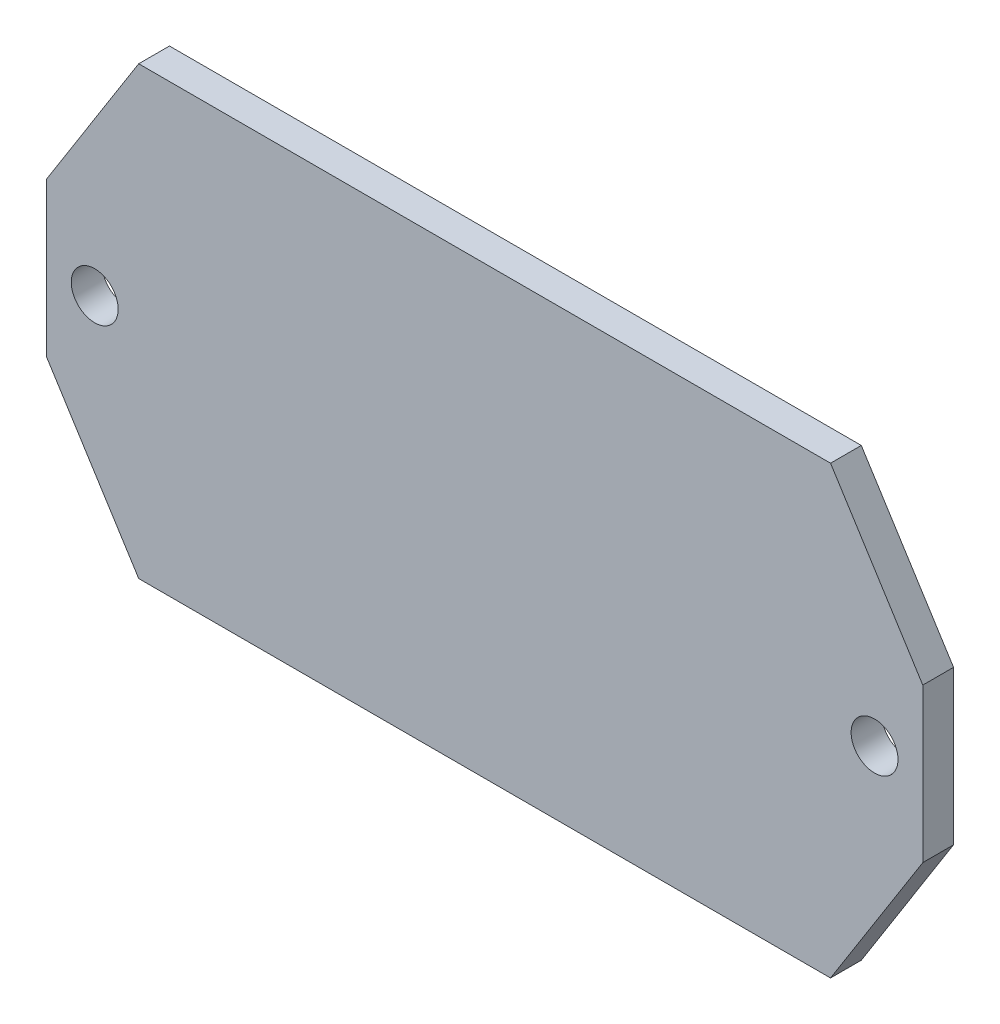
ISO-10303-21;
HEADER;
FILE_DESCRIPTION(('STEP AP214'),'2;1');
FILE_NAME('part.step','',(''),(''),'','','');
FILE_SCHEMA(('AUTOMOTIVE_DESIGN { 1 0 10303 214 1 1 1 1 }'));
ENDSEC;
DATA;
#1=APPLICATION_CONTEXT('core data for automotive mechanical design processes');
#2=APPLICATION_PROTOCOL_DEFINITION('international standard','automotive_design',2000,#1);
#3=PRODUCT_CONTEXT('',#1,'mechanical');
#4=PRODUCT('Part','Part','',(#3));
#5=PRODUCT_RELATED_PRODUCT_CATEGORY('part','',(#4));
#6=PRODUCT_DEFINITION_FORMATION('','',#4);
#7=PRODUCT_DEFINITION_CONTEXT('part definition',#1,'design');
#8=PRODUCT_DEFINITION('design','',#6,#7);
#9=PRODUCT_DEFINITION_SHAPE('','',#8);
#10=(LENGTH_UNIT() NAMED_UNIT(*) SI_UNIT(.MILLI.,.METRE.));
#11=(NAMED_UNIT(*) PLANE_ANGLE_UNIT() SI_UNIT($,.RADIAN.));
#12=(NAMED_UNIT(*) SI_UNIT($,.STERADIAN.) SOLID_ANGLE_UNIT());
#13=UNCERTAINTY_MEASURE_WITH_UNIT(LENGTH_MEASURE(1.E-05),#10,'distance_accuracy_value','');
#14=(GEOMETRIC_REPRESENTATION_CONTEXT(3) GLOBAL_UNCERTAINTY_ASSIGNED_CONTEXT((#13)) GLOBAL_UNIT_ASSIGNED_CONTEXT((#10,
#11,#12)) REPRESENTATION_CONTEXT('',''));
#15=CARTESIAN_POINT('',(0.,0.,0.));
#16=DIRECTION('',(0.,0.,1.));
#17=DIRECTION('',(1.,0.,0.));
#18=AXIS2_PLACEMENT_3D('',#15,#16,#17);
#19=CARTESIAN_POINT('',(-28.5,14.5,2.));
#20=DIRECTION('',(0.,-1.,0.));
#21=DIRECTION('',(0.,0.,-1.));
#22=AXIS2_PLACEMENT_3D('',#19,#20,#21);
#23=PLANE('',#22);
#24=DIRECTION('',(0.,0.,1.));
#25=VECTOR('',#24,1.);
#26=CARTESIAN_POINT('',(-22.5,14.5,0.));
#27=LINE('',#26,#25);
#28=CARTESIAN_POINT('',(-22.5,14.5,0.));
#29=VERTEX_POINT('',#28);
#30=CARTESIAN_POINT('',(-22.5,14.5,2.));
#31=VERTEX_POINT('',#30);
#32=EDGE_CURVE('E52',#29,#31,#27,.T.);
#33=ORIENTED_EDGE('',*,*,#32,.T.);
#34=DIRECTION('',(-1.,0.,0.));
#35=VECTOR('',#34,1.);
#36=CARTESIAN_POINT('',(-28.5,14.5,2.));
#37=LINE('',#36,#35);
#38=CARTESIAN_POINT('',(22.5,14.5,2.));
#39=VERTEX_POINT('',#38);
#40=EDGE_CURVE('E128',#39,#31,#37,.T.);
#41=ORIENTED_EDGE('',*,*,#40,.F.);
#42=DIRECTION('',(0.,0.,1.));
#43=VECTOR('',#42,1.);
#44=CARTESIAN_POINT('',(22.5,14.5,0.));
#45=LINE('',#44,#43);
#46=CARTESIAN_POINT('',(22.5,14.5,0.));
#47=VERTEX_POINT('',#46);
#48=EDGE_CURVE('E145',#47,#39,#45,.T.);
#49=ORIENTED_EDGE('',*,*,#48,.F.);
#50=DIRECTION('',(-1.,0.,0.));
#51=VECTOR('',#50,1.);
#52=CARTESIAN_POINT('',(-28.5,14.5,0.));
#53=LINE('',#52,#51);
#54=EDGE_CURVE('E119',#47,#29,#53,.T.);
#55=ORIENTED_EDGE('',*,*,#54,.T.);
#56=EDGE_LOOP('',(#33,#41,#49,#55));
#57=FACE_BOUND('',#56,.T.);
#58=ADVANCED_FACE('F35',(#57),#23,.F.);
#59=CARTESIAN_POINT('',(-28.5,-14.5,2.));
#60=DIRECTION('',(1.,0.,0.));
#61=DIRECTION('',(0.,0.,-1.));
#62=AXIS2_PLACEMENT_3D('',#59,#60,#61);
#63=PLANE('',#62);
#64=DIRECTION('',(0.,0.,1.));
#65=VECTOR('',#64,1.);
#66=CARTESIAN_POINT('',(-28.5,5.,0.));
#67=LINE('',#66,#65);
#68=CARTESIAN_POINT('',(-28.5,5.,0.));
#69=VERTEX_POINT('',#68);
#70=CARTESIAN_POINT('',(-28.5,5.,2.));
#71=VERTEX_POINT('',#70);
#72=EDGE_CURVE('E101',#69,#71,#67,.T.);
#73=ORIENTED_EDGE('',*,*,#72,.F.);
#74=DIRECTION('',(0.,-1.,0.));
#75=VECTOR('',#74,1.);
#76=CARTESIAN_POINT('',(-28.5,-14.5,0.));
#77=LINE('',#76,#75);
#78=CARTESIAN_POINT('',(-28.5,-4.99999999999999,0.));
#79=VERTEX_POINT('',#78);
#80=EDGE_CURVE('E113',#69,#79,#77,.T.);
#81=ORIENTED_EDGE('',*,*,#80,.T.);
#82=DIRECTION('',(0.,0.,1.));
#83=VECTOR('',#82,1.);
#84=CARTESIAN_POINT('',(-28.5,-5.,0.));
#85=LINE('',#84,#83);
#86=CARTESIAN_POINT('',(-28.5,-5.,2.));
#87=VERTEX_POINT('',#86);
#88=EDGE_CURVE('E60',#79,#87,#85,.T.);
#89=ORIENTED_EDGE('',*,*,#88,.T.);
#90=DIRECTION('',(0.,-1.,0.));
#91=VECTOR('',#90,1.);
#92=CARTESIAN_POINT('',(-28.5,-14.5,2.));
#93=LINE('',#92,#91);
#94=EDGE_CURVE('E44',#71,#87,#93,.T.);
#95=ORIENTED_EDGE('',*,*,#94,.F.);
#96=EDGE_LOOP('',(#73,#81,#89,#95));
#97=FACE_BOUND('',#96,.T.);
#98=ADVANCED_FACE('F112',(#97),#63,.F.);
#99=CARTESIAN_POINT('',(-28.5,-14.5,2.));
#100=DIRECTION('',(0.,1.,0.));
#101=DIRECTION('',(0.,0.,1.));
#102=AXIS2_PLACEMENT_3D('',#99,#100,#101);
#103=PLANE('',#102);
#104=DIRECTION('',(0.,0.,1.));
#105=VECTOR('',#104,1.);
#106=CARTESIAN_POINT('',(-22.5,-14.5,0.));
#107=LINE('',#106,#105);
#108=CARTESIAN_POINT('',(-22.5,-14.5,0.));
#109=VERTEX_POINT('',#108);
#110=CARTESIAN_POINT('',(-22.5,-14.5,2.));
#111=VERTEX_POINT('',#110);
#112=EDGE_CURVE('E153',#109,#111,#107,.T.);
#113=ORIENTED_EDGE('',*,*,#112,.F.);
#114=DIRECTION('',(1.,0.,0.));
#115=VECTOR('',#114,1.);
#116=CARTESIAN_POINT('',(-28.5,-14.5,0.));
#117=LINE('',#116,#115);
#118=CARTESIAN_POINT('',(22.5,-14.5,0.));
#119=VERTEX_POINT('',#118);
#120=EDGE_CURVE('E39',#109,#119,#117,.T.);
#121=ORIENTED_EDGE('',*,*,#120,.T.);
#122=DIRECTION('',(0.,0.,1.));
#123=VECTOR('',#122,1.);
#124=CARTESIAN_POINT('',(22.5,-14.5,0.));
#125=LINE('',#124,#123);
#126=CARTESIAN_POINT('',(22.5,-14.5,2.));
#127=VERTEX_POINT('',#126);
#128=EDGE_CURVE('E135',#119,#127,#125,.T.);
#129=ORIENTED_EDGE('',*,*,#128,.T.);
#130=DIRECTION('',(1.,0.,0.));
#131=VECTOR('',#130,1.);
#132=CARTESIAN_POINT('',(-28.5,-14.5,2.));
#133=LINE('',#132,#131);
#134=EDGE_CURVE('E11',#111,#127,#133,.T.);
#135=ORIENTED_EDGE('',*,*,#134,.F.);
#136=EDGE_LOOP('',(#113,#121,#129,#135));
#137=FACE_BOUND('',#136,.T.);
#138=ADVANCED_FACE('F187',(#137),#103,.F.);
#139=CARTESIAN_POINT('',(0.,0.,2.));
#140=DIRECTION('',(0.,0.,-1.));
#141=DIRECTION('',(-1.,0.,0.));
#142=AXIS2_PLACEMENT_3D('',#139,#140,#141);
#143=PLANE('',#142);
#144=CARTESIAN_POINT('',(25.3626697833113,0.,2.));
#145=DIRECTION('',(0.,0.,1.));
#146=DIRECTION('',(1.,0.,0.));
#147=AXIS2_PLACEMENT_3D('',#144,#145,#146);
#148=CIRCLE('',#147,1.525);
#149=CARTESIAN_POINT('',(26.8876697833113,0.,2.));
#150=VERTEX_POINT('',#149);
#151=EDGE_CURVE('E169',#150,#150,#148,.T.);
#152=ORIENTED_EDGE('',*,*,#151,.F.);
#153=EDGE_LOOP('',(#152));
#154=FACE_BOUND('',#153,.T.);
#155=CARTESIAN_POINT('',(-25.3626697833113,0.,2.));
#156=DIRECTION('',(0.,0.,1.));
#157=DIRECTION('',(-1.,0.,0.));
#158=AXIS2_PLACEMENT_3D('',#155,#156,#157);
#159=CIRCLE('',#158,1.525);
#160=CARTESIAN_POINT('',(-26.8876697833113,0.,2.));
#161=VERTEX_POINT('',#160);
#162=EDGE_CURVE('E163',#161,#161,#159,.T.);
#163=ORIENTED_EDGE('',*,*,#162,.F.);
#164=EDGE_LOOP('',(#163));
#165=FACE_BOUND('',#164,.T.);
#166=DIRECTION('',(-0.533992991387982,-0.845488903030971,0.));
#167=VECTOR('',#166,1.);
#168=CARTESIAN_POINT('',(-22.5,14.5,2.));
#169=LINE('',#168,#167);
#170=EDGE_CURVE('E107',#31,#71,#169,.T.);
#171=ORIENTED_EDGE('',*,*,#170,.T.);
#172=ORIENTED_EDGE('',*,*,#94,.T.);
#173=DIRECTION('',(0.533992991387982,-0.845488903030971,0.));
#174=VECTOR('',#173,1.);
#175=CARTESIAN_POINT('',(-22.5,-14.5,2.));
#176=LINE('',#175,#174);
#177=EDGE_CURVE('E156',#87,#111,#176,.T.);
#178=ORIENTED_EDGE('',*,*,#177,.T.);
#179=ORIENTED_EDGE('',*,*,#134,.T.);
#180=DIRECTION('',(-0.533992991387982,-0.845488903030971,0.));
#181=VECTOR('',#180,1.);
#182=CARTESIAN_POINT('',(22.5,-14.5,2.));
#183=LINE('',#182,#181);
#184=CARTESIAN_POINT('',(28.5,-5.,2.));
#185=VERTEX_POINT('',#184);
#186=EDGE_CURVE('E140',#185,#127,#183,.T.);
#187=ORIENTED_EDGE('',*,*,#186,.F.);
#188=DIRECTION('',(0.,1.,0.));
#189=VECTOR('',#188,1.);
#190=CARTESIAN_POINT('',(28.5,-14.5,2.));
#191=LINE('',#190,#189);
#192=CARTESIAN_POINT('',(28.5,5.,2.));
#193=VERTEX_POINT('',#192);
#194=EDGE_CURVE('E120',#185,#193,#191,.T.);
#195=ORIENTED_EDGE('',*,*,#194,.T.);
#196=DIRECTION('',(0.533992991387982,-0.845488903030971,0.));
#197=VECTOR('',#196,1.);
#198=CARTESIAN_POINT('',(22.5,14.5,2.));
#199=LINE('',#198,#197);
#200=EDGE_CURVE('E139',#39,#193,#199,.T.);
#201=ORIENTED_EDGE('',*,*,#200,.F.);
#202=ORIENTED_EDGE('',*,*,#40,.T.);
#203=EDGE_LOOP('',(#171,#172,#178,#179,#187,#195,#201,#202));
#204=FACE_BOUND('',#203,.T.);
#205=ADVANCED_FACE('F184',(#154,#165,#204),#143,.F.);
#206=CARTESIAN_POINT('',(0.,0.,0.));
#207=DIRECTION('',(0.,0.,-1.));
#208=DIRECTION('',(-1.,0.,0.));
#209=AXIS2_PLACEMENT_3D('',#206,#207,#208);
#210=PLANE('',#209);
#211=CARTESIAN_POINT('',(25.3626697833113,0.,0.));
#212=DIRECTION('',(0.,0.,1.));
#213=DIRECTION('',(1.,0.,0.));
#214=AXIS2_PLACEMENT_3D('',#211,#212,#213);
#215=CIRCLE('',#214,1.525);
#216=CARTESIAN_POINT('',(26.8876697833113,0.,0.));
#217=VERTEX_POINT('',#216);
#218=EDGE_CURVE('E159',#217,#217,#215,.T.);
#219=ORIENTED_EDGE('',*,*,#218,.T.);
#220=EDGE_LOOP('',(#219));
#221=FACE_BOUND('',#220,.T.);
#222=CARTESIAN_POINT('',(-25.3626697833113,0.,0.));
#223=DIRECTION('',(0.,0.,1.));
#224=DIRECTION('',(-1.,0.,0.));
#225=AXIS2_PLACEMENT_3D('',#222,#223,#224);
#226=CIRCLE('',#225,1.525);
#227=CARTESIAN_POINT('',(-26.8876697833113,0.,0.));
#228=VERTEX_POINT('',#227);
#229=EDGE_CURVE('E166',#228,#228,#226,.T.);
#230=ORIENTED_EDGE('',*,*,#229,.T.);
#231=EDGE_LOOP('',(#230));
#232=FACE_BOUND('',#231,.T.);
#233=ORIENTED_EDGE('',*,*,#80,.F.);
#234=DIRECTION('',(-0.533992991387982,-0.845488903030971,0.));
#235=VECTOR('',#234,1.);
#236=CARTESIAN_POINT('',(-22.5,14.5,0.));
#237=LINE('',#236,#235);
#238=EDGE_CURVE('E98',#29,#69,#237,.T.);
#239=ORIENTED_EDGE('',*,*,#238,.F.);
#240=ORIENTED_EDGE('',*,*,#54,.F.);
#241=DIRECTION('',(0.533992991387982,-0.845488903030971,0.));
#242=VECTOR('',#241,1.);
#243=CARTESIAN_POINT('',(22.5,14.5,0.));
#244=LINE('',#243,#242);
#245=CARTESIAN_POINT('',(28.5,4.99999999999997,0.));
#246=VERTEX_POINT('',#245);
#247=EDGE_CURVE('E147',#47,#246,#244,.T.);
#248=ORIENTED_EDGE('',*,*,#247,.T.);
#249=DIRECTION('',(0.,1.,0.));
#250=VECTOR('',#249,1.);
#251=CARTESIAN_POINT('',(28.5,-14.5,0.));
#252=LINE('',#251,#250);
#253=CARTESIAN_POINT('',(28.5,-5.,0.));
#254=VERTEX_POINT('',#253);
#255=EDGE_CURVE('E121',#254,#246,#252,.T.);
#256=ORIENTED_EDGE('',*,*,#255,.F.);
#257=DIRECTION('',(-0.533992991387982,-0.845488903030971,0.));
#258=VECTOR('',#257,1.);
#259=CARTESIAN_POINT('',(22.5,-14.5,0.));
#260=LINE('',#259,#258);
#261=EDGE_CURVE('E136',#254,#119,#260,.T.);
#262=ORIENTED_EDGE('',*,*,#261,.T.);
#263=ORIENTED_EDGE('',*,*,#120,.F.);
#264=DIRECTION('',(0.533992991387982,-0.845488903030971,0.));
#265=VECTOR('',#264,1.);
#266=CARTESIAN_POINT('',(-22.5,-14.5,0.));
#267=LINE('',#266,#265);
#268=EDGE_CURVE('E118',#79,#109,#267,.T.);
#269=ORIENTED_EDGE('',*,*,#268,.F.);
#270=EDGE_LOOP('',(#233,#239,#240,#248,#256,#262,#263,#269));
#271=FACE_BOUND('',#270,.T.);
#272=ADVANCED_FACE('F116',(#221,#232,#271),#210,.T.);
#273=CARTESIAN_POINT('',(28.5,-14.5,2.));
#274=DIRECTION('',(-1.,0.,0.));
#275=DIRECTION('',(0.,0.,1.));
#276=AXIS2_PLACEMENT_3D('',#273,#274,#275);
#277=PLANE('',#276);
#278=ORIENTED_EDGE('',*,*,#255,.T.);
#279=DIRECTION('',(0.,0.,1.));
#280=VECTOR('',#279,1.);
#281=CARTESIAN_POINT('',(28.5,5.,0.));
#282=LINE('',#281,#280);
#283=EDGE_CURVE('E125',#246,#193,#282,.T.);
#284=ORIENTED_EDGE('',*,*,#283,.T.);
#285=ORIENTED_EDGE('',*,*,#194,.F.);
#286=DIRECTION('',(0.,0.,1.));
#287=VECTOR('',#286,1.);
#288=CARTESIAN_POINT('',(28.5,-5.,0.));
#289=LINE('',#288,#287);
#290=EDGE_CURVE('E133',#254,#185,#289,.T.);
#291=ORIENTED_EDGE('',*,*,#290,.F.);
#292=EDGE_LOOP('',(#278,#284,#285,#291));
#293=FACE_BOUND('',#292,.T.);
#294=ADVANCED_FACE('F37',(#293),#277,.F.);
#295=CARTESIAN_POINT('',(22.5,-14.5,0.));
#296=DIRECTION('',(-0.845488903030971,0.533992991387982,0.));
#297=DIRECTION('',(-0.533992991387982,-0.845488903030971,0.));
#298=AXIS2_PLACEMENT_3D('',#295,#296,#297);
#299=PLANE('',#298);
#300=ORIENTED_EDGE('',*,*,#186,.T.);
#301=ORIENTED_EDGE('',*,*,#128,.F.);
#302=ORIENTED_EDGE('',*,*,#261,.F.);
#303=ORIENTED_EDGE('',*,*,#290,.T.);
#304=EDGE_LOOP('',(#300,#301,#302,#303));
#305=FACE_BOUND('',#304,.T.);
#306=ADVANCED_FACE('F202',(#305),#299,.F.);
#307=CARTESIAN_POINT('',(22.5,14.5,0.));
#308=DIRECTION('',(-0.845488903030971,-0.533992991387982,0.));
#309=DIRECTION('',(0.533992991387982,-0.845488903030971,0.));
#310=AXIS2_PLACEMENT_3D('',#307,#308,#309);
#311=PLANE('',#310);
#312=ORIENTED_EDGE('',*,*,#200,.T.);
#313=ORIENTED_EDGE('',*,*,#283,.F.);
#314=ORIENTED_EDGE('',*,*,#247,.F.);
#315=ORIENTED_EDGE('',*,*,#48,.T.);
#316=EDGE_LOOP('',(#312,#313,#314,#315));
#317=FACE_BOUND('',#316,.T.);
#318=ADVANCED_FACE('F209',(#317),#311,.F.);
#319=CARTESIAN_POINT('',(-22.5,-14.5,0.));
#320=DIRECTION('',(-0.845488903030971,-0.533992991387982,0.));
#321=DIRECTION('',(0.533992991387982,-0.845488903030971,0.));
#322=AXIS2_PLACEMENT_3D('',#319,#320,#321);
#323=PLANE('',#322);
#324=ORIENTED_EDGE('',*,*,#177,.F.);
#325=ORIENTED_EDGE('',*,*,#88,.F.);
#326=ORIENTED_EDGE('',*,*,#268,.T.);
#327=ORIENTED_EDGE('',*,*,#112,.T.);
#328=EDGE_LOOP('',(#324,#325,#326,#327));
#329=FACE_BOUND('',#328,.T.);
#330=ADVANCED_FACE('F207',(#329),#323,.T.);
#331=CARTESIAN_POINT('',(-22.5,14.5,0.));
#332=DIRECTION('',(-0.845488903030971,0.533992991387982,0.));
#333=DIRECTION('',(-0.533992991387982,-0.845488903030971,0.));
#334=AXIS2_PLACEMENT_3D('',#331,#332,#333);
#335=PLANE('',#334);
#336=ORIENTED_EDGE('',*,*,#170,.F.);
#337=ORIENTED_EDGE('',*,*,#32,.F.);
#338=ORIENTED_EDGE('',*,*,#238,.T.);
#339=ORIENTED_EDGE('',*,*,#72,.T.);
#340=EDGE_LOOP('',(#336,#337,#338,#339));
#341=FACE_BOUND('',#340,.T.);
#342=ADVANCED_FACE('F100',(#341),#335,.T.);
#343=CARTESIAN_POINT('',(-25.3626697833113,0.,0.));
#344=DIRECTION('',(0.,0.,1.));
#345=DIRECTION('',(1.,0.,0.));
#346=AXIS2_PLACEMENT_3D('',#343,#344,#345);
#347=CYLINDRICAL_SURFACE('',#346,1.525);
#348=ORIENTED_EDGE('',*,*,#229,.F.);
#349=EDGE_LOOP('',(#348));
#350=FACE_BOUND('',#349,.T.);
#351=ORIENTED_EDGE('',*,*,#162,.T.);
#352=EDGE_LOOP('',(#351));
#353=FACE_BOUND('',#352,.T.);
#354=ADVANCED_FACE('F180',(#350,#353),#347,.F.);
#355=CARTESIAN_POINT('',(25.3626697833113,0.,0.));
#356=DIRECTION('',(0.,0.,1.));
#357=DIRECTION('',(1.,0.,0.));
#358=AXIS2_PLACEMENT_3D('',#355,#356,#357);
#359=CYLINDRICAL_SURFACE('',#358,1.525);
#360=ORIENTED_EDGE('',*,*,#218,.F.);
#361=EDGE_LOOP('',(#360));
#362=FACE_BOUND('',#361,.T.);
#363=ORIENTED_EDGE('',*,*,#151,.T.);
#364=EDGE_LOOP('',(#363));
#365=FACE_BOUND('',#364,.T.);
#366=ADVANCED_FACE('F177',(#362,#365),#359,.F.);
#367=CLOSED_SHELL('',(#58,#98,#138,#205,#272,#294,#306,#318,#330,#342,#354,#366));
#368=MANIFOLD_SOLID_BREP('B2',#367);
#369=ADVANCED_BREP_SHAPE_REPRESENTATION('',(#18,#368),#14);
#370=SHAPE_DEFINITION_REPRESENTATION(#9,#369);
ENDSEC;
END-ISO-10303-21;
